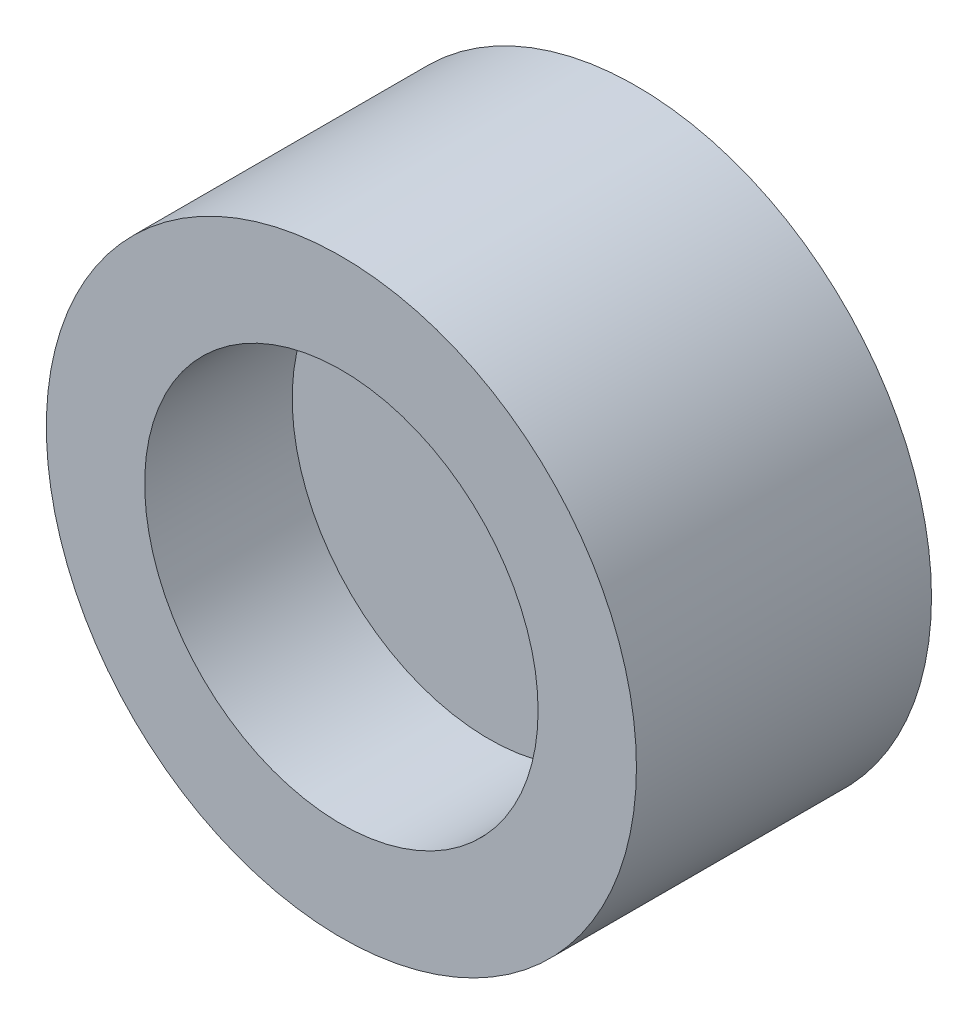
ISO-10303-21;
HEADER;
FILE_DESCRIPTION(('STEP AP214'),'2;1');
FILE_NAME('part.step','',(''),(''),'','','');
FILE_SCHEMA(('AUTOMOTIVE_DESIGN { 1 0 10303 214 1 1 1 1 }'));
ENDSEC;
DATA;
#1=APPLICATION_CONTEXT('core data for automotive mechanical design processes');
#2=APPLICATION_PROTOCOL_DEFINITION('international standard','automotive_design',2000,#1);
#3=PRODUCT_CONTEXT('',#1,'mechanical');
#4=PRODUCT('Part','Part','',(#3));
#5=PRODUCT_RELATED_PRODUCT_CATEGORY('part','',(#4));
#6=PRODUCT_DEFINITION_FORMATION('','',#4);
#7=PRODUCT_DEFINITION_CONTEXT('part definition',#1,'design');
#8=PRODUCT_DEFINITION('design','',#6,#7);
#9=PRODUCT_DEFINITION_SHAPE('','',#8);
#10=(LENGTH_UNIT() NAMED_UNIT(*) SI_UNIT(.MILLI.,.METRE.));
#11=(NAMED_UNIT(*) PLANE_ANGLE_UNIT() SI_UNIT($,.RADIAN.));
#12=(NAMED_UNIT(*) SI_UNIT($,.STERADIAN.) SOLID_ANGLE_UNIT());
#13=UNCERTAINTY_MEASURE_WITH_UNIT(LENGTH_MEASURE(1.E-05),#10,'distance_accuracy_value','');
#14=(GEOMETRIC_REPRESENTATION_CONTEXT(3) GLOBAL_UNCERTAINTY_ASSIGNED_CONTEXT((#13)) GLOBAL_UNIT_ASSIGNED_CONTEXT((#10,
#11,#12)) REPRESENTATION_CONTEXT('',''));
#15=CARTESIAN_POINT('',(0.,0.,0.));
#16=DIRECTION('',(0.,0.,1.));
#17=DIRECTION('',(1.,0.,0.));
#18=AXIS2_PLACEMENT_3D('',#15,#16,#17);
#19=CARTESIAN_POINT('',(0.,0.,3.));
#20=DIRECTION('',(0.,0.,-1.));
#21=DIRECTION('',(-1.,0.,0.));
#22=AXIS2_PLACEMENT_3D('',#19,#20,#21);
#23=CYLINDRICAL_SURFACE('',#22,3.);
#24=CARTESIAN_POINT('',(0.,0.,3.));
#25=DIRECTION('',(0.,0.,1.));
#26=DIRECTION('',(1.,0.,0.));
#27=AXIS2_PLACEMENT_3D('',#24,#25,#26);
#28=CIRCLE('',#27,3.);
#29=CARTESIAN_POINT('',(3.,0.,3.));
#30=VERTEX_POINT('',#29);
#31=EDGE_CURVE('E10',#30,#30,#28,.T.);
#32=ORIENTED_EDGE('',*,*,#31,.F.);
#33=EDGE_LOOP('',(#32));
#34=FACE_BOUND('',#33,.T.);
#35=CARTESIAN_POINT('',(0.,0.,0.));
#36=DIRECTION('',(0.,0.,1.));
#37=DIRECTION('',(1.,0.,0.));
#38=AXIS2_PLACEMENT_3D('',#35,#36,#37);
#39=CIRCLE('',#38,3.);
#40=CARTESIAN_POINT('',(3.,0.,0.));
#41=VERTEX_POINT('',#40);
#42=EDGE_CURVE('E40',#41,#41,#39,.T.);
#43=ORIENTED_EDGE('',*,*,#42,.T.);
#44=EDGE_LOOP('',(#43));
#45=FACE_BOUND('',#44,.T.);
#46=ADVANCED_FACE('F37',(#34,#45),#23,.T.);
#47=CARTESIAN_POINT('',(0.,0.,3.));
#48=DIRECTION('',(0.,0.,1.));
#49=DIRECTION('',(1.,0.,0.));
#50=AXIS2_PLACEMENT_3D('',#47,#48,#49);
#51=PLANE('',#50);
#52=CARTESIAN_POINT('',(0.,0.,3.));
#53=DIRECTION('',(0.,0.,1.));
#54=DIRECTION('',(1.,0.,0.));
#55=AXIS2_PLACEMENT_3D('',#52,#53,#54);
#56=CIRCLE('',#55,2.);
#57=CARTESIAN_POINT('',(2.,0.,3.));
#58=VERTEX_POINT('',#57);
#59=EDGE_CURVE('E49',#58,#58,#56,.T.);
#60=ORIENTED_EDGE('',*,*,#59,.F.);
#61=EDGE_LOOP('',(#60));
#62=FACE_BOUND('',#61,.T.);
#63=ORIENTED_EDGE('',*,*,#31,.T.);
#64=EDGE_LOOP('',(#63));
#65=FACE_BOUND('',#64,.T.);
#66=ADVANCED_FACE('F64',(#62,#65),#51,.T.);
#67=CARTESIAN_POINT('',(0.,0.,0.));
#68=DIRECTION('',(0.,0.,1.));
#69=DIRECTION('',(1.,0.,0.));
#70=AXIS2_PLACEMENT_3D('',#67,#68,#69);
#71=PLANE('',#70);
#72=ORIENTED_EDGE('',*,*,#42,.F.);
#73=EDGE_LOOP('',(#72));
#74=FACE_BOUND('',#73,.T.);
#75=ADVANCED_FACE('F60',(#74),#71,.F.);
#76=CARTESIAN_POINT('',(0.,0.,1.5));
#77=DIRECTION('',(0.,0.,1.));
#78=DIRECTION('',(1.,0.,0.));
#79=AXIS2_PLACEMENT_3D('',#76,#77,#78);
#80=CYLINDRICAL_SURFACE('',#79,2.);
#81=CARTESIAN_POINT('',(0.,0.,1.5));
#82=DIRECTION('',(0.,0.,1.));
#83=DIRECTION('',(1.,0.,0.));
#84=AXIS2_PLACEMENT_3D('',#81,#82,#83);
#85=CIRCLE('',#84,2.);
#86=CARTESIAN_POINT('',(2.,0.,1.5));
#87=VERTEX_POINT('',#86);
#88=EDGE_CURVE('E47',#87,#87,#85,.T.);
#89=ORIENTED_EDGE('',*,*,#88,.F.);
#90=EDGE_LOOP('',(#89));
#91=FACE_BOUND('',#90,.T.);
#92=ORIENTED_EDGE('',*,*,#59,.T.);
#93=EDGE_LOOP('',(#92));
#94=FACE_BOUND('',#93,.T.);
#95=ADVANCED_FACE('F57',(#91,#94),#80,.F.);
#96=CARTESIAN_POINT('',(0.,0.,1.5));
#97=DIRECTION('',(0.,0.,1.));
#98=DIRECTION('',(1.,0.,0.));
#99=AXIS2_PLACEMENT_3D('',#96,#97,#98);
#100=PLANE('',#99);
#101=ORIENTED_EDGE('',*,*,#88,.T.);
#102=EDGE_LOOP('',(#101));
#103=FACE_BOUND('',#102,.T.);
#104=ADVANCED_FACE('F55',(#103),#100,.T.);
#105=CLOSED_SHELL('',(#46,#66,#75,#95,#104));
#106=MANIFOLD_SOLID_BREP('B2',#105);
#107=ADVANCED_BREP_SHAPE_REPRESENTATION('',(#18,#106),#14);
#108=SHAPE_DEFINITION_REPRESENTATION(#9,#107);
ENDSEC;
END-ISO-10303-21;
